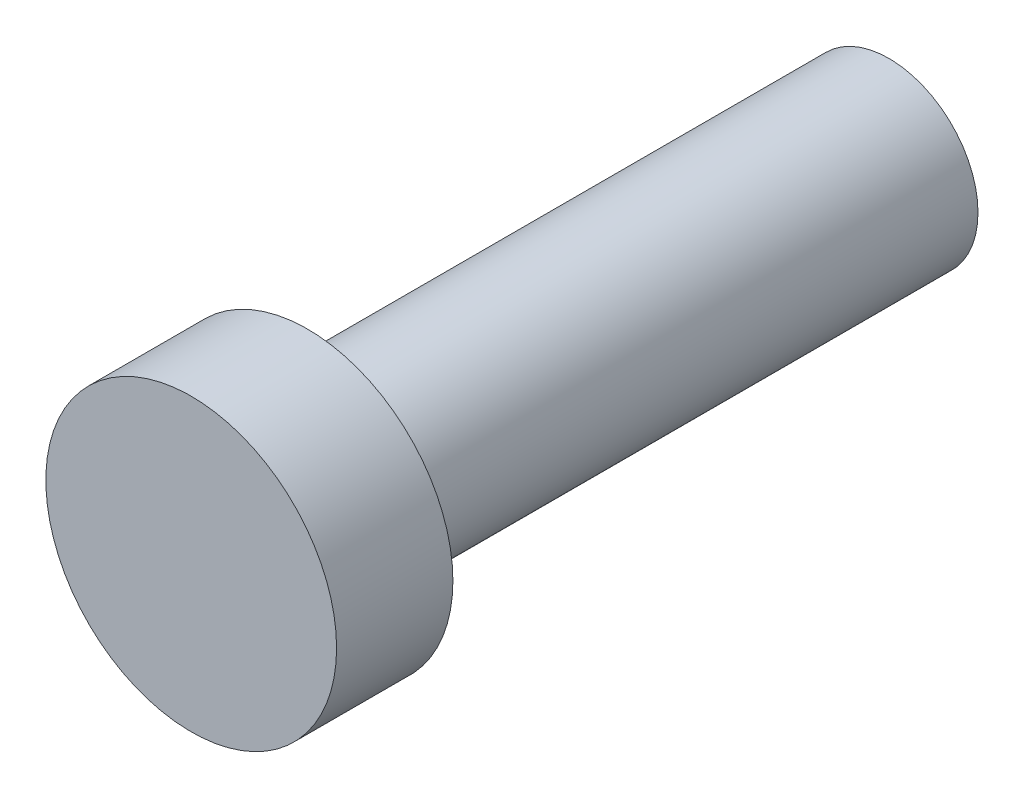
ISO-10303-21;
HEADER;
FILE_DESCRIPTION(('STEP AP214'),'2;1');
FILE_NAME('part.step','',(''),(''),'','','');
FILE_SCHEMA(('AUTOMOTIVE_DESIGN { 1 0 10303 214 1 1 1 1 }'));
ENDSEC;
DATA;
#1=APPLICATION_CONTEXT('core data for automotive mechanical design processes');
#2=APPLICATION_PROTOCOL_DEFINITION('international standard','automotive_design',2000,#1);
#3=PRODUCT_CONTEXT('',#1,'mechanical');
#4=PRODUCT('Part','Part','',(#3));
#5=PRODUCT_RELATED_PRODUCT_CATEGORY('part','',(#4));
#6=PRODUCT_DEFINITION_FORMATION('','',#4);
#7=PRODUCT_DEFINITION_CONTEXT('part definition',#1,'design');
#8=PRODUCT_DEFINITION('design','',#6,#7);
#9=PRODUCT_DEFINITION_SHAPE('','',#8);
#10=(LENGTH_UNIT() NAMED_UNIT(*) SI_UNIT(.MILLI.,.METRE.));
#11=(NAMED_UNIT(*) PLANE_ANGLE_UNIT() SI_UNIT($,.RADIAN.));
#12=(NAMED_UNIT(*) SI_UNIT($,.STERADIAN.) SOLID_ANGLE_UNIT());
#13=UNCERTAINTY_MEASURE_WITH_UNIT(LENGTH_MEASURE(1.E-05),#10,'distance_accuracy_value','');
#14=(GEOMETRIC_REPRESENTATION_CONTEXT(3) GLOBAL_UNCERTAINTY_ASSIGNED_CONTEXT((#13)) GLOBAL_UNIT_ASSIGNED_CONTEXT((#10,
#11,#12)) REPRESENTATION_CONTEXT('',''));
#15=CARTESIAN_POINT('',(0.,0.,0.));
#16=DIRECTION('',(0.,0.,1.));
#17=DIRECTION('',(1.,0.,0.));
#18=AXIS2_PLACEMENT_3D('',#15,#16,#17);
#19=CARTESIAN_POINT('',(0.,0.,10.));
#20=DIRECTION('',(0.,0.,-1.));
#21=DIRECTION('',(-1.,0.,0.));
#22=AXIS2_PLACEMENT_3D('',#19,#20,#21);
#23=CYLINDRICAL_SURFACE('',#22,1.53);
#24=CARTESIAN_POINT('',(0.,0.,10.));
#25=DIRECTION('',(0.,0.,1.));
#26=DIRECTION('',(1.,0.,0.));
#27=AXIS2_PLACEMENT_3D('',#24,#25,#26);
#28=CIRCLE('',#27,1.53);
#29=CARTESIAN_POINT('',(1.53,0.,10.));
#30=VERTEX_POINT('',#29);
#31=EDGE_CURVE('E10',#30,#30,#28,.T.);
#32=ORIENTED_EDGE('',*,*,#31,.F.);
#33=EDGE_LOOP('',(#32));
#34=FACE_BOUND('',#33,.T.);
#35=CARTESIAN_POINT('',(0.,0.,0.));
#36=DIRECTION('',(0.,0.,1.));
#37=DIRECTION('',(1.,0.,0.));
#38=AXIS2_PLACEMENT_3D('',#35,#36,#37);
#39=CIRCLE('',#38,1.53);
#40=CARTESIAN_POINT('',(1.53,0.,0.));
#41=VERTEX_POINT('',#40);
#42=EDGE_CURVE('E44',#41,#41,#39,.T.);
#43=ORIENTED_EDGE('',*,*,#42,.T.);
#44=EDGE_LOOP('',(#43));
#45=FACE_BOUND('',#44,.T.);
#46=ADVANCED_FACE('F41',(#34,#45),#23,.T.);
#47=CARTESIAN_POINT('',(0.,0.,0.));
#48=DIRECTION('',(0.,0.,1.));
#49=DIRECTION('',(1.,0.,0.));
#50=AXIS2_PLACEMENT_3D('',#47,#48,#49);
#51=PLANE('',#50);
#52=ORIENTED_EDGE('',*,*,#42,.F.);
#53=EDGE_LOOP('',(#52));
#54=FACE_BOUND('',#53,.T.);
#55=ADVANCED_FACE('F68',(#54),#51,.F.);
#56=CARTESIAN_POINT('',(0.,0.,12.));
#57=DIRECTION('',(0.,0.,-1.));
#58=DIRECTION('',(-1.,0.,0.));
#59=AXIS2_PLACEMENT_3D('',#56,#57,#58);
#60=CYLINDRICAL_SURFACE('',#59,2.5);
#61=CARTESIAN_POINT('',(0.,0.,12.));
#62=DIRECTION('',(0.,0.,1.));
#63=DIRECTION('',(1.,0.,0.));
#64=AXIS2_PLACEMENT_3D('',#61,#62,#63);
#65=CIRCLE('',#64,2.5);
#66=CARTESIAN_POINT('',(2.5,0.,12.));
#67=VERTEX_POINT('',#66);
#68=EDGE_CURVE('E53',#67,#67,#65,.T.);
#69=ORIENTED_EDGE('',*,*,#68,.F.);
#70=EDGE_LOOP('',(#69));
#71=FACE_BOUND('',#70,.T.);
#72=CARTESIAN_POINT('',(0.,0.,10.));
#73=DIRECTION('',(0.,0.,1.));
#74=DIRECTION('',(1.,0.,0.));
#75=AXIS2_PLACEMENT_3D('',#72,#73,#74);
#76=CIRCLE('',#75,2.5);
#77=CARTESIAN_POINT('',(2.5,0.,10.));
#78=VERTEX_POINT('',#77);
#79=EDGE_CURVE('E55',#78,#78,#76,.T.);
#80=ORIENTED_EDGE('',*,*,#79,.T.);
#81=EDGE_LOOP('',(#80));
#82=FACE_BOUND('',#81,.T.);
#83=ADVANCED_FACE('F65',(#71,#82),#60,.T.);
#84=CARTESIAN_POINT('',(0.,0.,12.));
#85=DIRECTION('',(0.,0.,1.));
#86=DIRECTION('',(1.,0.,0.));
#87=AXIS2_PLACEMENT_3D('',#84,#85,#86);
#88=PLANE('',#87);
#89=ORIENTED_EDGE('',*,*,#68,.T.);
#90=EDGE_LOOP('',(#89));
#91=FACE_BOUND('',#90,.T.);
#92=ADVANCED_FACE('F63',(#91),#88,.T.);
#93=CARTESIAN_POINT('',(0.,0.,10.));
#94=DIRECTION('',(0.,0.,1.));
#95=DIRECTION('',(1.,0.,0.));
#96=AXIS2_PLACEMENT_3D('',#93,#94,#95);
#97=PLANE('',#96);
#98=ORIENTED_EDGE('',*,*,#31,.T.);
#99=EDGE_LOOP('',(#98));
#100=FACE_BOUND('',#99,.T.);
#101=ORIENTED_EDGE('',*,*,#79,.F.);
#102=EDGE_LOOP('',(#101));
#103=FACE_BOUND('',#102,.T.);
#104=ADVANCED_FACE('F72',(#100,#103),#97,.F.);
#105=CLOSED_SHELL('',(#46,#55,#83,#92,#104));
#106=MANIFOLD_SOLID_BREP('B2',#105);
#107=ADVANCED_BREP_SHAPE_REPRESENTATION('',(#18,#106),#14);
#108=SHAPE_DEFINITION_REPRESENTATION(#9,#107);
ENDSEC;
END-ISO-10303-21;
